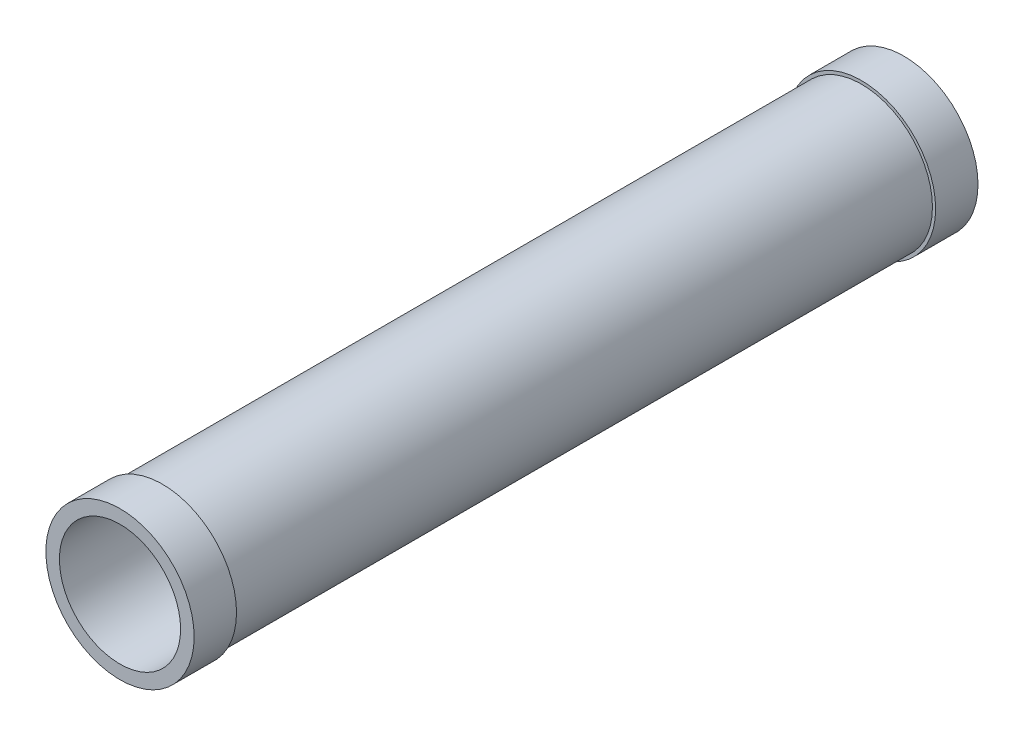
ISO-10303-21;
HEADER;
FILE_DESCRIPTION(('STEP AP214'),'2;1');
FILE_NAME('part.step','',(''),(''),'','','');
FILE_SCHEMA(('AUTOMOTIVE_DESIGN { 1 0 10303 214 1 1 1 1 }'));
ENDSEC;
DATA;
#1=APPLICATION_CONTEXT('core data for automotive mechanical design processes');
#2=APPLICATION_PROTOCOL_DEFINITION('international standard','automotive_design',2000,#1);
#3=PRODUCT_CONTEXT('',#1,'mechanical');
#4=PRODUCT('Part','Part','',(#3));
#5=PRODUCT_RELATED_PRODUCT_CATEGORY('part','',(#4));
#6=PRODUCT_DEFINITION_FORMATION('','',#4);
#7=PRODUCT_DEFINITION_CONTEXT('part definition',#1,'design');
#8=PRODUCT_DEFINITION('design','',#6,#7);
#9=PRODUCT_DEFINITION_SHAPE('','',#8);
#10=(LENGTH_UNIT() NAMED_UNIT(*) SI_UNIT(.MILLI.,.METRE.));
#11=(NAMED_UNIT(*) PLANE_ANGLE_UNIT() SI_UNIT($,.RADIAN.));
#12=(NAMED_UNIT(*) SI_UNIT($,.STERADIAN.) SOLID_ANGLE_UNIT());
#13=UNCERTAINTY_MEASURE_WITH_UNIT(LENGTH_MEASURE(1.E-05),#10,'distance_accuracy_value','');
#14=(GEOMETRIC_REPRESENTATION_CONTEXT(3) GLOBAL_UNCERTAINTY_ASSIGNED_CONTEXT((#13)) GLOBAL_UNIT_ASSIGNED_CONTEXT((#10,
#11,#12)) REPRESENTATION_CONTEXT('',''));
#15=CARTESIAN_POINT('',(0.,0.,0.));
#16=DIRECTION('',(0.,0.,1.));
#17=DIRECTION('',(1.,0.,0.));
#18=AXIS2_PLACEMENT_3D('',#15,#16,#17);
#19=CARTESIAN_POINT('',(0.,0.,92.5));
#20=DIRECTION('',(0.,0.,-1.));
#21=DIRECTION('',(-1.,0.,0.));
#22=AXIS2_PLACEMENT_3D('',#19,#20,#21);
#23=CYLINDRICAL_SURFACE('',#22,17.5);
#24=CARTESIAN_POINT('',(0.,0.,-92.5));
#25=DIRECTION('',(0.,0.,1.));
#26=DIRECTION('',(1.,0.,0.));
#27=AXIS2_PLACEMENT_3D('',#24,#25,#26);
#28=CIRCLE('',#27,17.5);
#29=CARTESIAN_POINT('',(17.5,0.,-92.5));
#30=VERTEX_POINT('',#29);
#31=EDGE_CURVE('E41',#30,#30,#28,.T.);
#32=ORIENTED_EDGE('',*,*,#31,.T.);
#33=EDGE_LOOP('',(#32));
#34=FACE_BOUND('',#33,.T.);
#35=CARTESIAN_POINT('',(0.,0.,-82.5));
#36=DIRECTION('',(0.,0.,1.));
#37=DIRECTION('',(1.,0.,0.));
#38=AXIS2_PLACEMENT_3D('',#35,#36,#37);
#39=CIRCLE('',#38,17.5);
#40=CARTESIAN_POINT('',(17.5,0.,-82.5));
#41=VERTEX_POINT('',#40);
#42=EDGE_CURVE('E37',#41,#41,#39,.T.);
#43=ORIENTED_EDGE('',*,*,#42,.F.);
#44=EDGE_LOOP('',(#43));
#45=FACE_BOUND('',#44,.T.);
#46=ADVANCED_FACE('F33',(#34,#45),#23,.T.);
#47=CARTESIAN_POINT('',(0.,0.,92.5));
#48=DIRECTION('',(0.,0.,1.));
#49=DIRECTION('',(1.,0.,0.));
#50=AXIS2_PLACEMENT_3D('',#47,#48,#49);
#51=PLANE('',#50);
#52=CARTESIAN_POINT('',(0.,0.,92.5));
#53=DIRECTION('',(0.,0.,1.));
#54=DIRECTION('',(1.,0.,0.));
#55=AXIS2_PLACEMENT_3D('',#52,#53,#54);
#56=CIRCLE('',#55,17.5);
#57=CARTESIAN_POINT('',(17.5,0.,92.5));
#58=VERTEX_POINT('',#57);
#59=EDGE_CURVE('E11',#58,#58,#56,.T.);
#60=ORIENTED_EDGE('',*,*,#59,.T.);
#61=EDGE_LOOP('',(#60));
#62=FACE_BOUND('',#61,.T.);
#63=CARTESIAN_POINT('',(0.,0.,92.5));
#64=DIRECTION('',(0.,0.,1.));
#65=DIRECTION('',(1.,0.,0.));
#66=AXIS2_PLACEMENT_3D('',#63,#64,#65);
#67=CIRCLE('',#66,14.3);
#68=CARTESIAN_POINT('',(14.3,0.,92.5));
#69=VERTEX_POINT('',#68);
#70=EDGE_CURVE('E46',#69,#69,#67,.T.);
#71=ORIENTED_EDGE('',*,*,#70,.F.);
#72=EDGE_LOOP('',(#71));
#73=FACE_BOUND('',#72,.T.);
#74=ADVANCED_FACE('F86',(#62,#73),#51,.T.);
#75=CARTESIAN_POINT('',(0.,0.,-92.5));
#76=DIRECTION('',(0.,0.,1.));
#77=DIRECTION('',(1.,0.,0.));
#78=AXIS2_PLACEMENT_3D('',#75,#76,#77);
#79=PLANE('',#78);
#80=ORIENTED_EDGE('',*,*,#31,.F.);
#81=EDGE_LOOP('',(#80));
#82=FACE_BOUND('',#81,.T.);
#83=CARTESIAN_POINT('',(0.,0.,-92.5));
#84=DIRECTION('',(0.,0.,1.));
#85=DIRECTION('',(1.,0.,0.));
#86=AXIS2_PLACEMENT_3D('',#83,#84,#85);
#87=CIRCLE('',#86,14.3);
#88=CARTESIAN_POINT('',(14.3,0.,-92.5));
#89=VERTEX_POINT('',#88);
#90=EDGE_CURVE('E49',#89,#89,#87,.T.);
#91=ORIENTED_EDGE('',*,*,#90,.T.);
#92=EDGE_LOOP('',(#91));
#93=FACE_BOUND('',#92,.T.);
#94=ADVANCED_FACE('F70',(#82,#93),#79,.F.);
#95=CARTESIAN_POINT('',(0.,0.,82.5));
#96=DIRECTION('',(0.,0.,1.));
#97=DIRECTION('',(1.,0.,0.));
#98=AXIS2_PLACEMENT_3D('',#95,#96,#97);
#99=CIRCLE('',#98,17.5);
#100=CARTESIAN_POINT('',(17.5,0.,82.5));
#101=VERTEX_POINT('',#100);
#102=EDGE_CURVE('E51',#101,#101,#99,.T.);
#103=ORIENTED_EDGE('',*,*,#102,.T.);
#104=EDGE_LOOP('',(#103));
#105=FACE_BOUND('',#104,.T.);
#106=ORIENTED_EDGE('',*,*,#59,.F.);
#107=EDGE_LOOP('',(#106));
#108=FACE_BOUND('',#107,.T.);
#109=ADVANCED_FACE('F35',(#105,#108),#23,.T.);
#110=CARTESIAN_POINT('',(0.,0.,92.5));
#111=DIRECTION('',(0.,0.,-1.));
#112=DIRECTION('',(-1.,0.,0.));
#113=AXIS2_PLACEMENT_3D('',#110,#111,#112);
#114=CYLINDRICAL_SURFACE('',#113,14.3);
#115=ORIENTED_EDGE('',*,*,#70,.T.);
#116=EDGE_LOOP('',(#115));
#117=FACE_BOUND('',#116,.T.);
#118=ORIENTED_EDGE('',*,*,#90,.F.);
#119=EDGE_LOOP('',(#118));
#120=FACE_BOUND('',#119,.T.);
#121=ADVANCED_FACE('F72',(#117,#120),#114,.F.);
#122=CARTESIAN_POINT('',(0.,0.,-82.5));
#123=DIRECTION('',(0.,0.,1.));
#124=DIRECTION('',(1.,0.,0.));
#125=AXIS2_PLACEMENT_3D('',#122,#123,#124);
#126=PLANE('',#125);
#127=CARTESIAN_POINT('',(0.,0.,-82.5));
#128=DIRECTION('',(0.,0.,1.));
#129=DIRECTION('',(1.,0.,0.));
#130=AXIS2_PLACEMENT_3D('',#127,#128,#129);
#131=CIRCLE('',#130,16.75);
#132=CARTESIAN_POINT('',(16.75,0.,-82.5));
#133=VERTEX_POINT('',#132);
#134=EDGE_CURVE('E53',#133,#133,#131,.T.);
#135=ORIENTED_EDGE('',*,*,#134,.F.);
#136=EDGE_LOOP('',(#135));
#137=FACE_BOUND('',#136,.T.);
#138=ORIENTED_EDGE('',*,*,#42,.T.);
#139=EDGE_LOOP('',(#138));
#140=FACE_BOUND('',#139,.T.);
#141=ADVANCED_FACE('F74',(#137,#140),#126,.T.);
#142=CARTESIAN_POINT('',(0.,0.,82.5));
#143=DIRECTION('',(0.,0.,1.));
#144=DIRECTION('',(1.,0.,0.));
#145=AXIS2_PLACEMENT_3D('',#142,#143,#144);
#146=PLANE('',#145);
#147=CARTESIAN_POINT('',(0.,0.,82.5));
#148=DIRECTION('',(0.,0.,1.));
#149=DIRECTION('',(1.,0.,0.));
#150=AXIS2_PLACEMENT_3D('',#147,#148,#149);
#151=CIRCLE('',#150,16.75);
#152=CARTESIAN_POINT('',(16.75,0.,82.5));
#153=VERTEX_POINT('',#152);
#154=EDGE_CURVE('E58',#153,#153,#151,.T.);
#155=ORIENTED_EDGE('',*,*,#154,.T.);
#156=EDGE_LOOP('',(#155));
#157=FACE_BOUND('',#156,.T.);
#158=ORIENTED_EDGE('',*,*,#102,.F.);
#159=EDGE_LOOP('',(#158));
#160=FACE_BOUND('',#159,.T.);
#161=ADVANCED_FACE('F80',(#157,#160),#146,.F.);
#162=CARTESIAN_POINT('',(0.,0.,-82.5));
#163=DIRECTION('',(0.,0.,1.));
#164=DIRECTION('',(1.,0.,0.));
#165=AXIS2_PLACEMENT_3D('',#162,#163,#164);
#166=CYLINDRICAL_SURFACE('',#165,16.75);
#167=ORIENTED_EDGE('',*,*,#134,.T.);
#168=EDGE_LOOP('',(#167));
#169=FACE_BOUND('',#168,.T.);
#170=ORIENTED_EDGE('',*,*,#154,.F.);
#171=EDGE_LOOP('',(#170));
#172=FACE_BOUND('',#171,.T.);
#173=ADVANCED_FACE('F123',(#169,#172),#166,.T.);
#174=CLOSED_SHELL('',(#46,#74,#94,#109,#121,#141,#161,#173));
#175=MANIFOLD_SOLID_BREP('B2',#174);
#176=ADVANCED_BREP_SHAPE_REPRESENTATION('',(#18,#175),#14);
#177=SHAPE_DEFINITION_REPRESENTATION(#9,#176);
ENDSEC;
END-ISO-10303-21;
